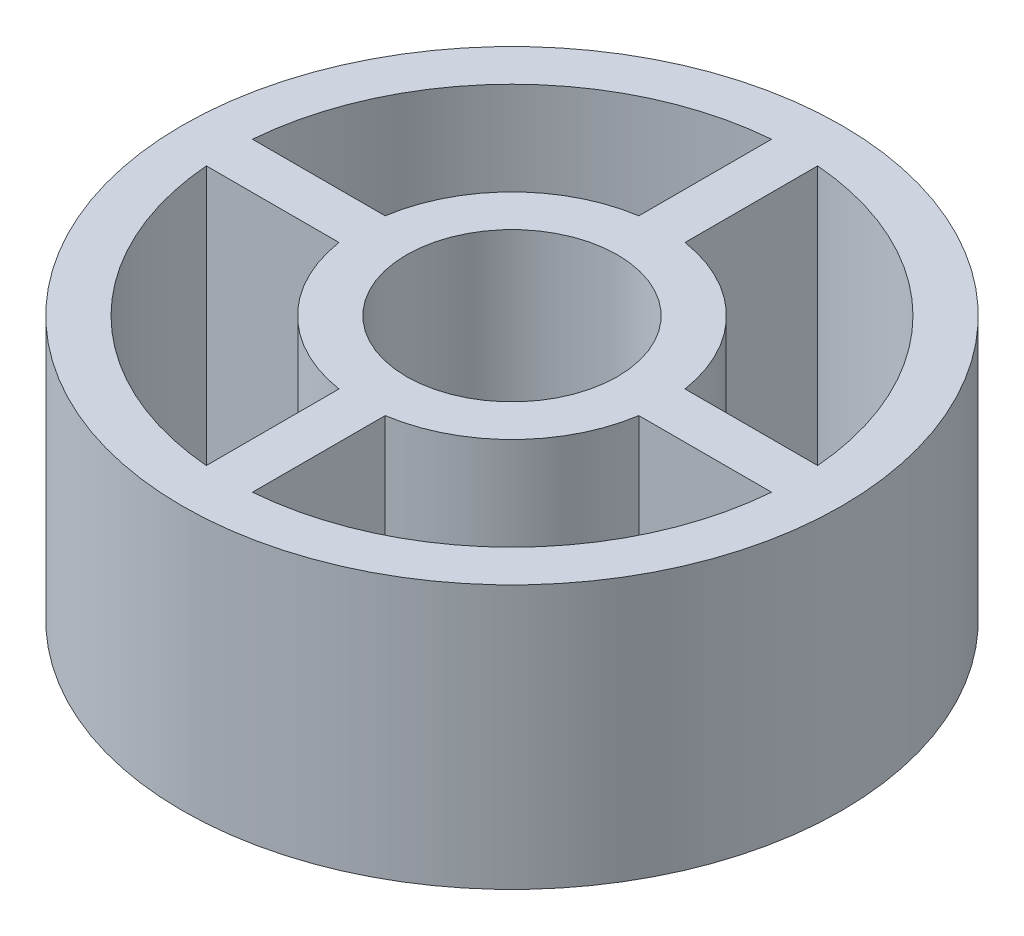
ISO-10303-21;
HEADER;
FILE_DESCRIPTION(('STEP AP214'),'2;1');
FILE_NAME('part.step','',(''),(''),'','','');
FILE_SCHEMA(('AUTOMOTIVE_DESIGN { 1 0 10303 214 1 1 1 1 }'));
ENDSEC;
DATA;
#1=APPLICATION_CONTEXT('core data for automotive mechanical design processes');
#2=APPLICATION_PROTOCOL_DEFINITION('international standard','automotive_design',2000,#1);
#3=PRODUCT_CONTEXT('',#1,'mechanical');
#4=PRODUCT('Part','Part','',(#3));
#5=PRODUCT_RELATED_PRODUCT_CATEGORY('part','',(#4));
#6=PRODUCT_DEFINITION_FORMATION('','',#4);
#7=PRODUCT_DEFINITION_CONTEXT('part definition',#1,'design');
#8=PRODUCT_DEFINITION('design','',#6,#7);
#9=PRODUCT_DEFINITION_SHAPE('','',#8);
#10=(LENGTH_UNIT() NAMED_UNIT(*) SI_UNIT(.MILLI.,.METRE.));
#11=(NAMED_UNIT(*) PLANE_ANGLE_UNIT() SI_UNIT($,.RADIAN.));
#12=(NAMED_UNIT(*) SI_UNIT($,.STERADIAN.) SOLID_ANGLE_UNIT());
#13=UNCERTAINTY_MEASURE_WITH_UNIT(LENGTH_MEASURE(1.E-05),#10,'distance_accuracy_value','');
#14=(GEOMETRIC_REPRESENTATION_CONTEXT(3) GLOBAL_UNCERTAINTY_ASSIGNED_CONTEXT((#13)) GLOBAL_UNIT_ASSIGNED_CONTEXT((#10,
#11,#12)) REPRESENTATION_CONTEXT('',''));
#15=CARTESIAN_POINT('',(0.,0.,0.));
#16=DIRECTION('',(0.,0.,1.));
#17=DIRECTION('',(1.,0.,0.));
#18=AXIS2_PLACEMENT_3D('',#15,#16,#17);
#19=CARTESIAN_POINT('',(0.,4.,0.));
#20=DIRECTION('',(0.,1.,0.));
#21=DIRECTION('',(0.,0.,1.));
#22=AXIS2_PLACEMENT_3D('',#19,#20,#21);
#23=PLANE('',#22);
#24=CARTESIAN_POINT('',(0.,4.,0.));
#25=DIRECTION('',(0.,1.,0.));
#26=DIRECTION('',(0.,0.,1.));
#27=AXIS2_PLACEMENT_3D('',#24,#25,#26);
#28=CIRCLE('',#27,5.);
#29=CARTESIAN_POINT('',(0.,4.,5.));
#30=VERTEX_POINT('',#29);
#31=EDGE_CURVE('E11',#30,#30,#28,.T.);
#32=ORIENTED_EDGE('',*,*,#31,.T.);
#33=EDGE_LOOP('',(#32));
#34=FACE_BOUND('',#33,.T.);
#35=CARTESIAN_POINT('',(0.,4.,0.));
#36=DIRECTION('',(0.,1.,0.));
#37=DIRECTION('',(0.,0.,1.));
#38=AXIS2_PLACEMENT_3D('',#35,#36,#37);
#39=CIRCLE('',#38,1.6);
#40=CARTESIAN_POINT('',(0.,4.,1.6));
#41=VERTEX_POINT('',#40);
#42=EDGE_CURVE('E277',#41,#41,#39,.T.);
#43=ORIENTED_EDGE('',*,*,#42,.F.);
#44=EDGE_LOOP('',(#43));
#45=FACE_BOUND('',#44,.T.);
#46=DIRECTION('',(1.,0.,0.));
#47=VECTOR('',#46,1.);
#48=CARTESIAN_POINT('',(2.27321358433386,4.,-0.35));
#49=LINE('',#48,#47);
#50=CARTESIAN_POINT('',(2.27321358433386,4.,-0.35));
#51=VERTEX_POINT('',#50);
#52=CARTESIAN_POINT('',(4.28573214281994,4.,-0.35));
#53=VERTEX_POINT('',#52);
#54=EDGE_CURVE('E248',#51,#53,#49,.T.);
#55=ORIENTED_EDGE('',*,*,#54,.F.);
#56=CARTESIAN_POINT('',(0.,4.,0.));
#57=DIRECTION('',(0.,-1.,0.));
#58=DIRECTION('',(0.,0.,1.));
#59=AXIS2_PLACEMENT_3D('',#56,#57,#58);
#60=CIRCLE('',#59,2.3);
#61=CARTESIAN_POINT('',(0.350000000000024,4.,-2.27321358433386));
#62=VERTEX_POINT('',#61);
#63=EDGE_CURVE('E246',#62,#51,#60,.T.);
#64=ORIENTED_EDGE('',*,*,#63,.F.);
#65=DIRECTION('',(0.,0.,1.));
#66=VECTOR('',#65,1.);
#67=CARTESIAN_POINT('',(0.349999999999999,4.,-4.28573214281994));
#68=LINE('',#67,#66);
#69=CARTESIAN_POINT('',(0.349999999999999,4.,-4.28573214281994));
#70=VERTEX_POINT('',#69);
#71=EDGE_CURVE('E254',#70,#62,#68,.T.);
#72=ORIENTED_EDGE('',*,*,#71,.F.);
#73=CARTESIAN_POINT('',(0.,4.,0.));
#74=DIRECTION('',(0.,1.,0.));
#75=DIRECTION('',(0.,0.,1.));
#76=AXIS2_PLACEMENT_3D('',#73,#74,#75);
#77=CIRCLE('',#76,4.3);
#78=EDGE_CURVE('E251',#53,#70,#77,.T.);
#79=ORIENTED_EDGE('',*,*,#78,.F.);
#80=EDGE_LOOP('',(#55,#64,#72,#79));
#81=FACE_BOUND('',#80,.T.);
#82=DIRECTION('',(-1.,0.,0.));
#83=VECTOR('',#82,1.);
#84=CARTESIAN_POINT('',(4.28573214281994,4.,0.35));
#85=LINE('',#84,#83);
#86=CARTESIAN_POINT('',(4.28573214281994,4.,0.35));
#87=VERTEX_POINT('',#86);
#88=CARTESIAN_POINT('',(2.27321358433386,4.,0.35));
#89=VERTEX_POINT('',#88);
#90=EDGE_CURVE('E217',#87,#89,#85,.T.);
#91=ORIENTED_EDGE('',*,*,#90,.F.);
#92=CARTESIAN_POINT('',(0.,4.,0.));
#93=DIRECTION('',(0.,1.,0.));
#94=DIRECTION('',(0.,0.,1.));
#95=AXIS2_PLACEMENT_3D('',#92,#93,#94);
#96=CIRCLE('',#95,4.3);
#97=CARTESIAN_POINT('',(0.35,4.,4.28573214281994));
#98=VERTEX_POINT('',#97);
#99=EDGE_CURVE('E215',#98,#87,#96,.T.);
#100=ORIENTED_EDGE('',*,*,#99,.F.);
#101=DIRECTION('',(0.,0.,1.));
#102=VECTOR('',#101,1.);
#103=CARTESIAN_POINT('',(0.349999999999992,4.,2.27321358433386));
#104=LINE('',#103,#102);
#105=CARTESIAN_POINT('',(0.349999999999992,4.,2.27321358433386));
#106=VERTEX_POINT('',#105);
#107=EDGE_CURVE('E223',#106,#98,#104,.T.);
#108=ORIENTED_EDGE('',*,*,#107,.F.);
#109=CARTESIAN_POINT('',(0.,4.,0.));
#110=DIRECTION('',(0.,-1.,0.));
#111=DIRECTION('',(0.,0.,1.));
#112=AXIS2_PLACEMENT_3D('',#109,#110,#111);
#113=CIRCLE('',#112,2.3);
#114=EDGE_CURVE('E220',#89,#106,#113,.T.);
#115=ORIENTED_EDGE('',*,*,#114,.F.);
#116=EDGE_LOOP('',(#91,#100,#108,#115));
#117=FACE_BOUND('',#116,.T.);
#118=DIRECTION('',(0.,0.,-1.));
#119=VECTOR('',#118,1.);
#120=CARTESIAN_POINT('',(-0.35,4.,4.28573214281994));
#121=LINE('',#120,#119);
#122=CARTESIAN_POINT('',(-0.35,4.,4.28573214281994));
#123=VERTEX_POINT('',#122);
#124=CARTESIAN_POINT('',(-0.350000000000008,4.,2.27321358433386));
#125=VERTEX_POINT('',#124);
#126=EDGE_CURVE('E186',#123,#125,#121,.T.);
#127=ORIENTED_EDGE('',*,*,#126,.F.);
#128=CARTESIAN_POINT('',(0.,4.,0.));
#129=DIRECTION('',(0.,1.,0.));
#130=DIRECTION('',(0.,0.,1.));
#131=AXIS2_PLACEMENT_3D('',#128,#129,#130);
#132=CIRCLE('',#131,4.3);
#133=CARTESIAN_POINT('',(-4.28573214281994,4.,0.350000000000001));
#134=VERTEX_POINT('',#133);
#135=EDGE_CURVE('E184',#134,#123,#132,.T.);
#136=ORIENTED_EDGE('',*,*,#135,.F.);
#137=DIRECTION('',(-1.,0.,0.));
#138=VECTOR('',#137,1.);
#139=CARTESIAN_POINT('',(-2.27321358433386,4.,0.349999999999984));
#140=LINE('',#139,#138);
#141=CARTESIAN_POINT('',(-2.27321358433386,4.,0.349999999999984));
#142=VERTEX_POINT('',#141);
#143=EDGE_CURVE('E192',#142,#134,#140,.T.);
#144=ORIENTED_EDGE('',*,*,#143,.F.);
#145=CARTESIAN_POINT('',(0.,4.,0.));
#146=DIRECTION('',(0.,-1.,0.));
#147=DIRECTION('',(0.,0.,1.));
#148=AXIS2_PLACEMENT_3D('',#145,#146,#147);
#149=CIRCLE('',#148,2.3);
#150=EDGE_CURVE('E189',#125,#142,#149,.T.);
#151=ORIENTED_EDGE('',*,*,#150,.F.);
#152=EDGE_LOOP('',(#127,#136,#144,#151));
#153=FACE_BOUND('',#152,.T.);
#154=DIRECTION('',(1.,0.,0.));
#155=VECTOR('',#154,1.);
#156=CARTESIAN_POINT('',(-4.28573214281994,4.,-0.35));
#157=LINE('',#156,#155);
#158=CARTESIAN_POINT('',(-4.28573214281994,4.,-0.35));
#159=VERTEX_POINT('',#158);
#160=CARTESIAN_POINT('',(-2.27321358433386,4.,-0.350000000000016));
#161=VERTEX_POINT('',#160);
#162=EDGE_CURVE('E156',#159,#161,#157,.T.);
#163=ORIENTED_EDGE('',*,*,#162,.F.);
#164=CARTESIAN_POINT('',(0.,4.,0.));
#165=DIRECTION('',(0.,1.,0.));
#166=DIRECTION('',(0.,0.,1.));
#167=AXIS2_PLACEMENT_3D('',#164,#165,#166);
#168=CIRCLE('',#167,4.3);
#169=CARTESIAN_POINT('',(-0.350000000000001,4.,-4.28573214281994));
#170=VERTEX_POINT('',#169);
#171=EDGE_CURVE('E148',#170,#159,#168,.T.);
#172=ORIENTED_EDGE('',*,*,#171,.F.);
#173=DIRECTION('',(0.,0.,-1.));
#174=VECTOR('',#173,1.);
#175=CARTESIAN_POINT('',(-0.349999999999976,4.,-2.27321358433386));
#176=LINE('',#175,#174);
#177=CARTESIAN_POINT('',(-0.349999999999976,4.,-2.27321358433386));
#178=VERTEX_POINT('',#177);
#179=EDGE_CURVE('E170',#178,#170,#176,.T.);
#180=ORIENTED_EDGE('',*,*,#179,.F.);
#181=CARTESIAN_POINT('',(0.,4.,0.));
#182=DIRECTION('',(0.,-1.,0.));
#183=DIRECTION('',(0.,0.,1.));
#184=AXIS2_PLACEMENT_3D('',#181,#182,#183);
#185=CIRCLE('',#184,2.3);
#186=EDGE_CURVE('E168',#161,#178,#185,.T.);
#187=ORIENTED_EDGE('',*,*,#186,.F.);
#188=EDGE_LOOP('',(#163,#172,#180,#187));
#189=FACE_BOUND('',#188,.T.);
#190=ADVANCED_FACE('F35',(#34,#45,#81,#117,#153,#189),#23,.T.);
#191=CARTESIAN_POINT('',(0.,0.,0.));
#192=DIRECTION('',(0.,1.,0.));
#193=DIRECTION('',(0.,0.,1.));
#194=AXIS2_PLACEMENT_3D('',#191,#192,#193);
#195=PLANE('',#194);
#196=CARTESIAN_POINT('',(0.,0.,0.));
#197=DIRECTION('',(0.,1.,0.));
#198=DIRECTION('',(0.,0.,1.));
#199=AXIS2_PLACEMENT_3D('',#196,#197,#198);
#200=CIRCLE('',#199,4.3);
#201=CARTESIAN_POINT('',(-4.28573214281994,0.,0.350000000000001));
#202=VERTEX_POINT('',#201);
#203=CARTESIAN_POINT('',(-0.35,0.,4.28573214281994));
#204=VERTEX_POINT('',#203);
#205=EDGE_CURVE('E164',#202,#204,#200,.T.);
#206=ORIENTED_EDGE('',*,*,#205,.T.);
#207=DIRECTION('',(0.,0.,-1.));
#208=VECTOR('',#207,1.);
#209=CARTESIAN_POINT('',(-0.35,0.,4.28573214281994));
#210=LINE('',#209,#208);
#211=CARTESIAN_POINT('',(-0.350000000000008,0.,2.27321358433386));
#212=VERTEX_POINT('',#211);
#213=EDGE_CURVE('E197',#204,#212,#210,.T.);
#214=ORIENTED_EDGE('',*,*,#213,.T.);
#215=CARTESIAN_POINT('',(0.,0.,0.));
#216=DIRECTION('',(0.,-1.,0.));
#217=DIRECTION('',(0.,0.,1.));
#218=AXIS2_PLACEMENT_3D('',#215,#216,#217);
#219=CIRCLE('',#218,2.3);
#220=CARTESIAN_POINT('',(-2.27321358433386,0.,0.349999999999984));
#221=VERTEX_POINT('',#220);
#222=EDGE_CURVE('E200',#212,#221,#219,.T.);
#223=ORIENTED_EDGE('',*,*,#222,.T.);
#224=DIRECTION('',(-1.,0.,0.));
#225=VECTOR('',#224,1.);
#226=CARTESIAN_POINT('',(-2.27321358433386,0.,0.349999999999984));
#227=LINE('',#226,#225);
#228=EDGE_CURVE('E187',#221,#202,#227,.T.);
#229=ORIENTED_EDGE('',*,*,#228,.T.);
#230=EDGE_LOOP('',(#206,#214,#223,#229));
#231=FACE_BOUND('',#230,.T.);
#232=CARTESIAN_POINT('',(0.,0.,0.));
#233=DIRECTION('',(0.,-1.,0.));
#234=DIRECTION('',(0.,0.,1.));
#235=AXIS2_PLACEMENT_3D('',#232,#233,#234);
#236=CIRCLE('',#235,2.3);
#237=CARTESIAN_POINT('',(0.350000000000024,0.,-2.27321358433386));
#238=VERTEX_POINT('',#237);
#239=CARTESIAN_POINT('',(2.27321358433386,0.,-0.35));
#240=VERTEX_POINT('',#239);
#241=EDGE_CURVE('E245',#238,#240,#236,.T.);
#242=ORIENTED_EDGE('',*,*,#241,.T.);
#243=DIRECTION('',(1.,0.,0.));
#244=VECTOR('',#243,1.);
#245=CARTESIAN_POINT('',(2.27321358433386,0.,-0.35));
#246=LINE('',#245,#244);
#247=CARTESIAN_POINT('',(4.28573214281994,0.,-0.35));
#248=VERTEX_POINT('',#247);
#249=EDGE_CURVE('E259',#240,#248,#246,.T.);
#250=ORIENTED_EDGE('',*,*,#249,.T.);
#251=CARTESIAN_POINT('',(0.,0.,0.));
#252=DIRECTION('',(0.,1.,0.));
#253=DIRECTION('',(0.,0.,1.));
#254=AXIS2_PLACEMENT_3D('',#251,#252,#253);
#255=CIRCLE('',#254,4.3);
#256=CARTESIAN_POINT('',(0.35,0.,-4.28573214281994));
#257=VERTEX_POINT('',#256);
#258=EDGE_CURVE('E262',#248,#257,#255,.T.);
#259=ORIENTED_EDGE('',*,*,#258,.T.);
#260=DIRECTION('',(0.,0.,1.));
#261=VECTOR('',#260,1.);
#262=CARTESIAN_POINT('',(0.349999999999999,0.,-4.28573214281994));
#263=LINE('',#262,#261);
#264=EDGE_CURVE('E249',#257,#238,#263,.T.);
#265=ORIENTED_EDGE('',*,*,#264,.T.);
#266=EDGE_LOOP('',(#242,#250,#259,#265));
#267=FACE_BOUND('',#266,.T.);
#268=CARTESIAN_POINT('',(0.,0.,0.));
#269=DIRECTION('',(0.,1.,0.));
#270=DIRECTION('',(0.,0.,1.));
#271=AXIS2_PLACEMENT_3D('',#268,#269,#270);
#272=CIRCLE('',#271,5.);
#273=CARTESIAN_POINT('',(0.,0.,5.));
#274=VERTEX_POINT('',#273);
#275=EDGE_CURVE('E39',#274,#274,#272,.T.);
#276=ORIENTED_EDGE('',*,*,#275,.F.);
#277=EDGE_LOOP('',(#276));
#278=FACE_BOUND('',#277,.T.);
#279=CARTESIAN_POINT('',(0.,0.,0.));
#280=DIRECTION('',(0.,1.,0.));
#281=DIRECTION('',(0.,0.,1.));
#282=AXIS2_PLACEMENT_3D('',#279,#280,#281);
#283=CIRCLE('',#282,1.6);
#284=CARTESIAN_POINT('',(0.,0.,1.6));
#285=VERTEX_POINT('',#284);
#286=EDGE_CURVE('E276',#285,#285,#283,.T.);
#287=ORIENTED_EDGE('',*,*,#286,.T.);
#288=EDGE_LOOP('',(#287));
#289=FACE_BOUND('',#288,.T.);
#290=CARTESIAN_POINT('',(0.,0.,0.));
#291=DIRECTION('',(0.,1.,0.));
#292=DIRECTION('',(0.,0.,1.));
#293=AXIS2_PLACEMENT_3D('',#290,#291,#292);
#294=CIRCLE('',#293,4.3);
#295=CARTESIAN_POINT('',(0.35,0.,4.28573214281994));
#296=VERTEX_POINT('',#295);
#297=CARTESIAN_POINT('',(4.28573214281994,0.,0.35));
#298=VERTEX_POINT('',#297);
#299=EDGE_CURVE('E214',#296,#298,#294,.T.);
#300=ORIENTED_EDGE('',*,*,#299,.T.);
#301=DIRECTION('',(-1.,0.,0.));
#302=VECTOR('',#301,1.);
#303=CARTESIAN_POINT('',(4.28573214281994,0.,0.35));
#304=LINE('',#303,#302);
#305=CARTESIAN_POINT('',(2.27321358433386,0.,0.35));
#306=VERTEX_POINT('',#305);
#307=EDGE_CURVE('E228',#298,#306,#304,.T.);
#308=ORIENTED_EDGE('',*,*,#307,.T.);
#309=CARTESIAN_POINT('',(0.,0.,0.));
#310=DIRECTION('',(0.,-1.,0.));
#311=DIRECTION('',(0.,0.,1.));
#312=AXIS2_PLACEMENT_3D('',#309,#310,#311);
#313=CIRCLE('',#312,2.3);
#314=CARTESIAN_POINT('',(0.349999999999992,0.,2.27321358433386));
#315=VERTEX_POINT('',#314);
#316=EDGE_CURVE('E231',#306,#315,#313,.T.);
#317=ORIENTED_EDGE('',*,*,#316,.T.);
#318=DIRECTION('',(0.,0.,1.));
#319=VECTOR('',#318,1.);
#320=CARTESIAN_POINT('',(0.349999999999992,0.,2.27321358433386));
#321=LINE('',#320,#319);
#322=EDGE_CURVE('E218',#315,#296,#321,.T.);
#323=ORIENTED_EDGE('',*,*,#322,.T.);
#324=EDGE_LOOP('',(#300,#308,#317,#323));
#325=FACE_BOUND('',#324,.T.);
#326=CARTESIAN_POINT('',(0.,0.,0.));
#327=DIRECTION('',(0.,1.,0.));
#328=DIRECTION('',(0.,0.,1.));
#329=AXIS2_PLACEMENT_3D('',#326,#327,#328);
#330=CIRCLE('',#329,4.3);
#331=CARTESIAN_POINT('',(-0.350000000000001,0.,-4.28573214281994));
#332=VERTEX_POINT('',#331);
#333=CARTESIAN_POINT('',(-4.28573214281994,0.,-0.35));
#334=VERTEX_POINT('',#333);
#335=EDGE_CURVE('E58',#332,#334,#330,.T.);
#336=ORIENTED_EDGE('',*,*,#335,.T.);
#337=DIRECTION('',(1.,0.,0.));
#338=VECTOR('',#337,1.);
#339=CARTESIAN_POINT('',(-4.28573214281994,0.,-0.35));
#340=LINE('',#339,#338);
#341=CARTESIAN_POINT('',(-2.27321358433386,0.,-0.350000000000016));
#342=VERTEX_POINT('',#341);
#343=EDGE_CURVE('E163',#334,#342,#340,.T.);
#344=ORIENTED_EDGE('',*,*,#343,.T.);
#345=CARTESIAN_POINT('',(0.,0.,0.));
#346=DIRECTION('',(0.,-1.,0.));
#347=DIRECTION('',(0.,0.,1.));
#348=AXIS2_PLACEMENT_3D('',#345,#346,#347);
#349=CIRCLE('',#348,2.3);
#350=CARTESIAN_POINT('',(-0.349999999999975,0.,-2.27321358433386));
#351=VERTEX_POINT('',#350);
#352=EDGE_CURVE('E176',#342,#351,#349,.T.);
#353=ORIENTED_EDGE('',*,*,#352,.T.);
#354=DIRECTION('',(0.,0.,-1.));
#355=VECTOR('',#354,1.);
#356=CARTESIAN_POINT('',(-0.349999999999976,0.,-2.27321358433386));
#357=LINE('',#356,#355);
#358=EDGE_CURVE('E157',#351,#332,#357,.T.);
#359=ORIENTED_EDGE('',*,*,#358,.T.);
#360=EDGE_LOOP('',(#336,#344,#353,#359));
#361=FACE_BOUND('',#360,.T.);
#362=ADVANCED_FACE('F283',(#231,#267,#278,#289,#325,#361),#195,.F.);
#363=CARTESIAN_POINT('',(0.,4.,0.));
#364=DIRECTION('',(0.,-1.,0.));
#365=DIRECTION('',(0.,0.,-1.));
#366=AXIS2_PLACEMENT_3D('',#363,#364,#365);
#367=CYLINDRICAL_SURFACE('',#366,5.);
#368=ORIENTED_EDGE('',*,*,#31,.F.);
#369=EDGE_LOOP('',(#368));
#370=FACE_BOUND('',#369,.T.);
#371=ORIENTED_EDGE('',*,*,#275,.T.);
#372=EDGE_LOOP('',(#371));
#373=FACE_BOUND('',#372,.T.);
#374=ADVANCED_FACE('F37',(#370,#373),#367,.T.);
#375=CARTESIAN_POINT('',(0.,4.,0.));
#376=DIRECTION('',(0.,-1.,0.));
#377=DIRECTION('',(0.,0.,-1.));
#378=AXIS2_PLACEMENT_3D('',#375,#376,#377);
#379=CYLINDRICAL_SURFACE('',#378,1.6);
#380=ORIENTED_EDGE('',*,*,#42,.T.);
#381=EDGE_LOOP('',(#380));
#382=FACE_BOUND('',#381,.T.);
#383=ORIENTED_EDGE('',*,*,#286,.F.);
#384=EDGE_LOOP('',(#383));
#385=FACE_BOUND('',#384,.T.);
#386=ADVANCED_FACE('F286',(#382,#385),#379,.F.);
#387=CARTESIAN_POINT('',(0.,4.,0.));
#388=DIRECTION('',(0.,-1.,0.));
#389=DIRECTION('',(0.,0.,-1.));
#390=AXIS2_PLACEMENT_3D('',#387,#388,#389);
#391=CYLINDRICAL_SURFACE('',#390,2.3);
#392=ORIENTED_EDGE('',*,*,#241,.F.);
#393=DIRECTION('',(0.,-1.,0.));
#394=VECTOR('',#393,1.);
#395=CARTESIAN_POINT('',(0.350000000000024,4.,-2.27321358433386));
#396=LINE('',#395,#394);
#397=EDGE_CURVE('E256',#62,#238,#396,.T.);
#398=ORIENTED_EDGE('',*,*,#397,.F.);
#399=ORIENTED_EDGE('',*,*,#63,.T.);
#400=DIRECTION('',(0.,-1.,0.));
#401=VECTOR('',#400,1.);
#402=CARTESIAN_POINT('',(2.27321358433386,4.,-0.35));
#403=LINE('',#402,#401);
#404=EDGE_CURVE('E273',#51,#240,#403,.T.);
#405=ORIENTED_EDGE('',*,*,#404,.T.);
#406=EDGE_LOOP('',(#392,#398,#399,#405));
#407=FACE_BOUND('',#406,.T.);
#408=ADVANCED_FACE('F288',(#407),#391,.T.);
#409=CARTESIAN_POINT('',(2.27321358433386,4.,-0.35));
#410=DIRECTION('',(0.,0.,-1.));
#411=DIRECTION('',(-1.,0.,0.));
#412=AXIS2_PLACEMENT_3D('',#409,#410,#411);
#413=PLANE('',#412);
#414=ORIENTED_EDGE('',*,*,#249,.F.);
#415=ORIENTED_EDGE('',*,*,#404,.F.);
#416=ORIENTED_EDGE('',*,*,#54,.T.);
#417=DIRECTION('',(0.,-1.,0.));
#418=VECTOR('',#417,1.);
#419=CARTESIAN_POINT('',(4.28573214281994,4.,-0.35));
#420=LINE('',#419,#418);
#421=EDGE_CURVE('E271',#53,#248,#420,.T.);
#422=ORIENTED_EDGE('',*,*,#421,.T.);
#423=EDGE_LOOP('',(#414,#415,#416,#422));
#424=FACE_BOUND('',#423,.T.);
#425=ADVANCED_FACE('F295',(#424),#413,.T.);
#426=CARTESIAN_POINT('',(0.,4.,0.));
#427=DIRECTION('',(0.,-1.,0.));
#428=DIRECTION('',(0.,0.,-1.));
#429=AXIS2_PLACEMENT_3D('',#426,#427,#428);
#430=CYLINDRICAL_SURFACE('',#429,4.3);
#431=ORIENTED_EDGE('',*,*,#258,.F.);
#432=ORIENTED_EDGE('',*,*,#421,.F.);
#433=ORIENTED_EDGE('',*,*,#78,.T.);
#434=DIRECTION('',(0.,-1.,0.));
#435=VECTOR('',#434,1.);
#436=CARTESIAN_POINT('',(0.35,4.,-4.28573214281994));
#437=LINE('',#436,#435);
#438=EDGE_CURVE('E269',#70,#257,#437,.T.);
#439=ORIENTED_EDGE('',*,*,#438,.T.);
#440=EDGE_LOOP('',(#431,#432,#433,#439));
#441=FACE_BOUND('',#440,.T.);
#442=ADVANCED_FACE('F369',(#441),#430,.F.);
#443=CARTESIAN_POINT('',(0.349999999999999,4.,-4.28573214281994));
#444=DIRECTION('',(1.,0.,0.));
#445=DIRECTION('',(0.,0.,-1.));
#446=AXIS2_PLACEMENT_3D('',#443,#444,#445);
#447=PLANE('',#446);
#448=ORIENTED_EDGE('',*,*,#264,.F.);
#449=ORIENTED_EDGE('',*,*,#438,.F.);
#450=ORIENTED_EDGE('',*,*,#71,.T.);
#451=ORIENTED_EDGE('',*,*,#397,.T.);
#452=EDGE_LOOP('',(#448,#449,#450,#451));
#453=FACE_BOUND('',#452,.T.);
#454=ADVANCED_FACE('F365',(#453),#447,.T.);
#455=CARTESIAN_POINT('',(0.,4.,0.));
#456=DIRECTION('',(0.,-1.,0.));
#457=DIRECTION('',(0.,0.,-1.));
#458=AXIS2_PLACEMENT_3D('',#455,#456,#457);
#459=CYLINDRICAL_SURFACE('',#458,4.3);
#460=ORIENTED_EDGE('',*,*,#299,.F.);
#461=DIRECTION('',(0.,-1.,0.));
#462=VECTOR('',#461,1.);
#463=CARTESIAN_POINT('',(0.35,4.,4.28573214281994));
#464=LINE('',#463,#462);
#465=EDGE_CURVE('E225',#98,#296,#464,.T.);
#466=ORIENTED_EDGE('',*,*,#465,.F.);
#467=ORIENTED_EDGE('',*,*,#99,.T.);
#468=DIRECTION('',(0.,-1.,0.));
#469=VECTOR('',#468,1.);
#470=CARTESIAN_POINT('',(4.28573214281994,4.,0.35));
#471=LINE('',#470,#469);
#472=EDGE_CURVE('E242',#87,#298,#471,.T.);
#473=ORIENTED_EDGE('',*,*,#472,.T.);
#474=EDGE_LOOP('',(#460,#466,#467,#473));
#475=FACE_BOUND('',#474,.T.);
#476=ADVANCED_FACE('F361',(#475),#459,.F.);
#477=CARTESIAN_POINT('',(4.28573214281994,4.,0.35));
#478=DIRECTION('',(0.,0.,1.));
#479=DIRECTION('',(1.,0.,0.));
#480=AXIS2_PLACEMENT_3D('',#477,#478,#479);
#481=PLANE('',#480);
#482=ORIENTED_EDGE('',*,*,#307,.F.);
#483=ORIENTED_EDGE('',*,*,#472,.F.);
#484=ORIENTED_EDGE('',*,*,#90,.T.);
#485=DIRECTION('',(0.,-1.,0.));
#486=VECTOR('',#485,1.);
#487=CARTESIAN_POINT('',(2.27321358433386,4.,0.35));
#488=LINE('',#487,#486);
#489=EDGE_CURVE('E240',#89,#306,#488,.T.);
#490=ORIENTED_EDGE('',*,*,#489,.T.);
#491=EDGE_LOOP('',(#482,#483,#484,#490));
#492=FACE_BOUND('',#491,.T.);
#493=ADVANCED_FACE('F357',(#492),#481,.T.);
#494=CARTESIAN_POINT('',(0.,4.,0.));
#495=DIRECTION('',(0.,-1.,0.));
#496=DIRECTION('',(0.,0.,-1.));
#497=AXIS2_PLACEMENT_3D('',#494,#495,#496);
#498=CYLINDRICAL_SURFACE('',#497,2.3);
#499=ORIENTED_EDGE('',*,*,#316,.F.);
#500=ORIENTED_EDGE('',*,*,#489,.F.);
#501=ORIENTED_EDGE('',*,*,#114,.T.);
#502=DIRECTION('',(0.,-1.,0.));
#503=VECTOR('',#502,1.);
#504=CARTESIAN_POINT('',(0.349999999999992,4.,2.27321358433386));
#505=LINE('',#504,#503);
#506=EDGE_CURVE('E238',#106,#315,#505,.T.);
#507=ORIENTED_EDGE('',*,*,#506,.T.);
#508=EDGE_LOOP('',(#499,#500,#501,#507));
#509=FACE_BOUND('',#508,.T.);
#510=ADVANCED_FACE('F353',(#509),#498,.T.);
#511=CARTESIAN_POINT('',(0.349999999999992,4.,2.27321358433386));
#512=DIRECTION('',(1.,0.,0.));
#513=DIRECTION('',(0.,0.,-1.));
#514=AXIS2_PLACEMENT_3D('',#511,#512,#513);
#515=PLANE('',#514);
#516=ORIENTED_EDGE('',*,*,#322,.F.);
#517=ORIENTED_EDGE('',*,*,#506,.F.);
#518=ORIENTED_EDGE('',*,*,#107,.T.);
#519=ORIENTED_EDGE('',*,*,#465,.T.);
#520=EDGE_LOOP('',(#516,#517,#518,#519));
#521=FACE_BOUND('',#520,.T.);
#522=ADVANCED_FACE('F350',(#521),#515,.T.);
#523=CARTESIAN_POINT('',(0.,4.,0.));
#524=DIRECTION('',(0.,-1.,0.));
#525=DIRECTION('',(0.,0.,-1.));
#526=AXIS2_PLACEMENT_3D('',#523,#524,#525);
#527=CYLINDRICAL_SURFACE('',#526,4.3);
#528=ORIENTED_EDGE('',*,*,#205,.F.);
#529=DIRECTION('',(0.,-1.,0.));
#530=VECTOR('',#529,1.);
#531=CARTESIAN_POINT('',(-4.28573214281994,4.,0.350000000000001));
#532=LINE('',#531,#530);
#533=EDGE_CURVE('E194',#134,#202,#532,.T.);
#534=ORIENTED_EDGE('',*,*,#533,.F.);
#535=ORIENTED_EDGE('',*,*,#135,.T.);
#536=DIRECTION('',(0.,-1.,0.));
#537=VECTOR('',#536,1.);
#538=CARTESIAN_POINT('',(-0.35,4.,4.28573214281994));
#539=LINE('',#538,#537);
#540=EDGE_CURVE('E211',#123,#204,#539,.T.);
#541=ORIENTED_EDGE('',*,*,#540,.T.);
#542=EDGE_LOOP('',(#528,#534,#535,#541));
#543=FACE_BOUND('',#542,.T.);
#544=ADVANCED_FACE('F332',(#543),#527,.F.);
#545=CARTESIAN_POINT('',(-0.35,4.,4.28573214281994));
#546=DIRECTION('',(-1.,0.,0.));
#547=DIRECTION('',(0.,0.,1.));
#548=AXIS2_PLACEMENT_3D('',#545,#546,#547);
#549=PLANE('',#548);
#550=ORIENTED_EDGE('',*,*,#213,.F.);
#551=ORIENTED_EDGE('',*,*,#540,.F.);
#552=ORIENTED_EDGE('',*,*,#126,.T.);
#553=DIRECTION('',(0.,-1.,0.));
#554=VECTOR('',#553,1.);
#555=CARTESIAN_POINT('',(-0.350000000000008,4.,2.27321358433386));
#556=LINE('',#555,#554);
#557=EDGE_CURVE('E209',#125,#212,#556,.T.);
#558=ORIENTED_EDGE('',*,*,#557,.T.);
#559=EDGE_LOOP('',(#550,#551,#552,#558));
#560=FACE_BOUND('',#559,.T.);
#561=ADVANCED_FACE('F325',(#560),#549,.T.);
#562=CARTESIAN_POINT('',(0.,4.,0.));
#563=DIRECTION('',(0.,-1.,0.));
#564=DIRECTION('',(0.,0.,-1.));
#565=AXIS2_PLACEMENT_3D('',#562,#563,#564);
#566=CYLINDRICAL_SURFACE('',#565,2.3);
#567=ORIENTED_EDGE('',*,*,#222,.F.);
#568=ORIENTED_EDGE('',*,*,#557,.F.);
#569=ORIENTED_EDGE('',*,*,#150,.T.);
#570=DIRECTION('',(0.,-1.,0.));
#571=VECTOR('',#570,1.);
#572=CARTESIAN_POINT('',(-2.27321358433386,4.,0.349999999999984));
#573=LINE('',#572,#571);
#574=EDGE_CURVE('E207',#142,#221,#573,.T.);
#575=ORIENTED_EDGE('',*,*,#574,.T.);
#576=EDGE_LOOP('',(#567,#568,#569,#575));
#577=FACE_BOUND('',#576,.T.);
#578=ADVANCED_FACE('F328',(#577),#566,.T.);
#579=CARTESIAN_POINT('',(-2.27321358433386,4.,0.349999999999984));
#580=DIRECTION('',(0.,0.,1.));
#581=DIRECTION('',(1.,0.,0.));
#582=AXIS2_PLACEMENT_3D('',#579,#580,#581);
#583=PLANE('',#582);
#584=ORIENTED_EDGE('',*,*,#228,.F.);
#585=ORIENTED_EDGE('',*,*,#574,.F.);
#586=ORIENTED_EDGE('',*,*,#143,.T.);
#587=ORIENTED_EDGE('',*,*,#533,.T.);
#588=EDGE_LOOP('',(#584,#585,#586,#587));
#589=FACE_BOUND('',#588,.T.);
#590=ADVANCED_FACE('F335',(#589),#583,.T.);
#591=CARTESIAN_POINT('',(0.,4.,0.));
#592=DIRECTION('',(0.,-1.,0.));
#593=DIRECTION('',(0.,0.,-1.));
#594=AXIS2_PLACEMENT_3D('',#591,#592,#593);
#595=CYLINDRICAL_SURFACE('',#594,4.3);
#596=ORIENTED_EDGE('',*,*,#335,.F.);
#597=DIRECTION('',(0.,-1.,0.));
#598=VECTOR('',#597,1.);
#599=CARTESIAN_POINT('',(-0.350000000000001,4.,-4.28573214281994));
#600=LINE('',#599,#598);
#601=EDGE_CURVE('E152',#170,#332,#600,.T.);
#602=ORIENTED_EDGE('',*,*,#601,.F.);
#603=ORIENTED_EDGE('',*,*,#171,.T.);
#604=DIRECTION('',(0.,-1.,0.));
#605=VECTOR('',#604,1.);
#606=CARTESIAN_POINT('',(-4.28573214281994,4.,-0.35));
#607=LINE('',#606,#605);
#608=EDGE_CURVE('E151',#159,#334,#607,.T.);
#609=ORIENTED_EDGE('',*,*,#608,.T.);
#610=EDGE_LOOP('',(#596,#602,#603,#609));
#611=FACE_BOUND('',#610,.T.);
#612=ADVANCED_FACE('F150',(#611),#595,.F.);
#613=CARTESIAN_POINT('',(-4.28573214281994,4.,-0.35));
#614=DIRECTION('',(0.,0.,-1.));
#615=DIRECTION('',(-1.,0.,0.));
#616=AXIS2_PLACEMENT_3D('',#613,#614,#615);
#617=PLANE('',#616);
#618=ORIENTED_EDGE('',*,*,#343,.F.);
#619=ORIENTED_EDGE('',*,*,#608,.F.);
#620=ORIENTED_EDGE('',*,*,#162,.T.);
#621=DIRECTION('',(0.,-1.,0.));
#622=VECTOR('',#621,1.);
#623=CARTESIAN_POINT('',(-2.27321358433386,4.,-0.350000000000016));
#624=LINE('',#623,#622);
#625=EDGE_CURVE('E165',#161,#342,#624,.T.);
#626=ORIENTED_EDGE('',*,*,#625,.T.);
#627=EDGE_LOOP('',(#618,#619,#620,#626));
#628=FACE_BOUND('',#627,.T.);
#629=ADVANCED_FACE('F160',(#628),#617,.T.);
#630=CARTESIAN_POINT('',(0.,4.,0.));
#631=DIRECTION('',(0.,-1.,0.));
#632=DIRECTION('',(0.,0.,-1.));
#633=AXIS2_PLACEMENT_3D('',#630,#631,#632);
#634=CYLINDRICAL_SURFACE('',#633,2.3);
#635=ORIENTED_EDGE('',*,*,#352,.F.);
#636=ORIENTED_EDGE('',*,*,#625,.F.);
#637=ORIENTED_EDGE('',*,*,#186,.T.);
#638=DIRECTION('',(0.,-1.,0.));
#639=VECTOR('',#638,1.);
#640=CARTESIAN_POINT('',(-0.349999999999975,4.,-2.27321358433386));
#641=LINE('',#640,#639);
#642=EDGE_CURVE('E50',#178,#351,#641,.T.);
#643=ORIENTED_EDGE('',*,*,#642,.T.);
#644=EDGE_LOOP('',(#635,#636,#637,#643));
#645=FACE_BOUND('',#644,.T.);
#646=ADVANCED_FACE('F445',(#645),#634,.T.);
#647=CARTESIAN_POINT('',(-0.349999999999976,4.,-2.27321358433386));
#648=DIRECTION('',(-1.,0.,0.));
#649=DIRECTION('',(0.,0.,1.));
#650=AXIS2_PLACEMENT_3D('',#647,#648,#649);
#651=PLANE('',#650);
#652=ORIENTED_EDGE('',*,*,#358,.F.);
#653=ORIENTED_EDGE('',*,*,#642,.F.);
#654=ORIENTED_EDGE('',*,*,#179,.T.);
#655=ORIENTED_EDGE('',*,*,#601,.T.);
#656=EDGE_LOOP('',(#652,#653,#654,#655));
#657=FACE_BOUND('',#656,.T.);
#658=ADVANCED_FACE('F453',(#657),#651,.T.);
#659=CLOSED_SHELL('',(#190,#362,#374,#386,#408,#425,#442,#454,#476,#493,#510,#522,#544,#561,
#578,#590,#612,#629,#646,#658));
#660=MANIFOLD_SOLID_BREP('B2',#659);
#661=ADVANCED_BREP_SHAPE_REPRESENTATION('',(#18,#660),#14);
#662=SHAPE_DEFINITION_REPRESENTATION(#9,#661);
ENDSEC;
END-ISO-10303-21;
